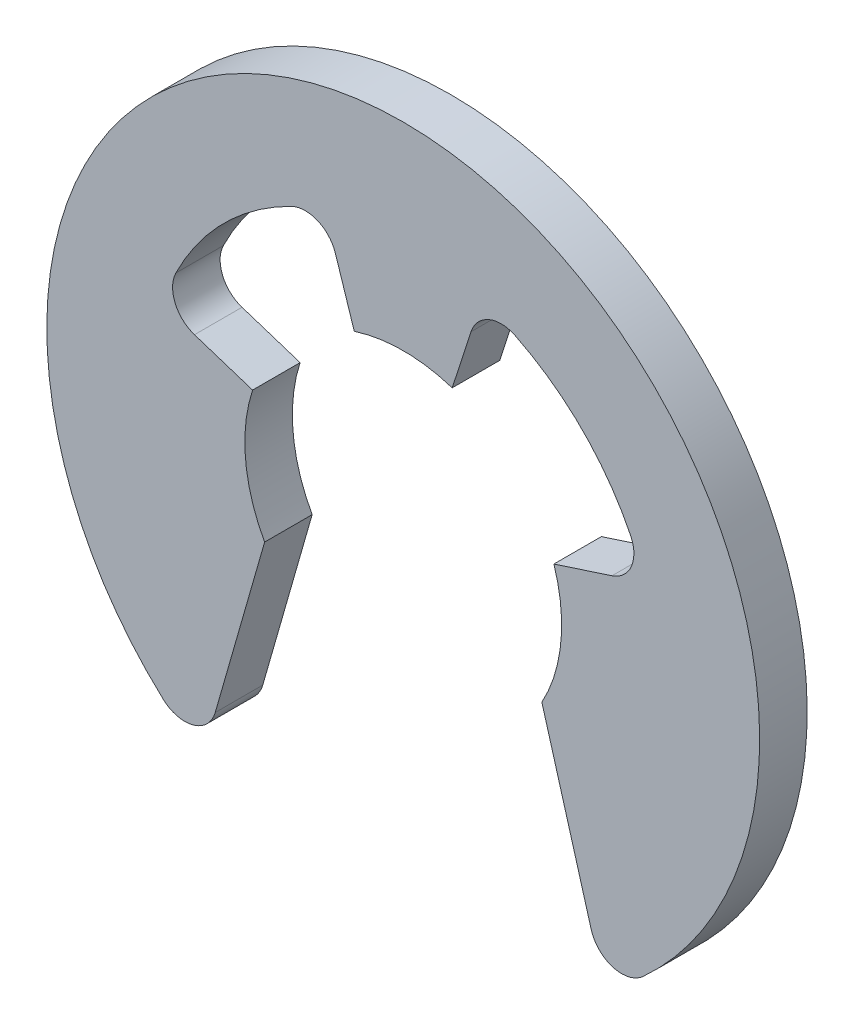
ISO-10303-21;
HEADER;
FILE_DESCRIPTION(('STEP AP214'),'2;1');
FILE_NAME('part.step','',(''),(''),'','','');
FILE_SCHEMA(('AUTOMOTIVE_DESIGN { 1 0 10303 214 1 1 1 1 }'));
ENDSEC;
DATA;
#1=APPLICATION_CONTEXT('core data for automotive mechanical design processes');
#2=APPLICATION_PROTOCOL_DEFINITION('international standard','automotive_design',2000,#1);
#3=PRODUCT_CONTEXT('',#1,'mechanical');
#4=PRODUCT('Part','Part','',(#3));
#5=PRODUCT_RELATED_PRODUCT_CATEGORY('part','',(#4));
#6=PRODUCT_DEFINITION_FORMATION('','',#4);
#7=PRODUCT_DEFINITION_CONTEXT('part definition',#1,'design');
#8=PRODUCT_DEFINITION('design','',#6,#7);
#9=PRODUCT_DEFINITION_SHAPE('','',#8);
#10=(LENGTH_UNIT() NAMED_UNIT(*) SI_UNIT(.MILLI.,.METRE.));
#11=(NAMED_UNIT(*) PLANE_ANGLE_UNIT() SI_UNIT($,.RADIAN.));
#12=(NAMED_UNIT(*) SI_UNIT($,.STERADIAN.) SOLID_ANGLE_UNIT());
#13=UNCERTAINTY_MEASURE_WITH_UNIT(LENGTH_MEASURE(1.E-05),#10,'distance_accuracy_value','');
#14=(GEOMETRIC_REPRESENTATION_CONTEXT(3) GLOBAL_UNCERTAINTY_ASSIGNED_CONTEXT((#13)) GLOBAL_UNIT_ASSIGNED_CONTEXT((#10,
#11,#12)) REPRESENTATION_CONTEXT('',''));
#15=CARTESIAN_POINT('',(0.,0.,0.));
#16=DIRECTION('',(0.,0.,1.));
#17=DIRECTION('',(1.,0.,0.));
#18=AXIS2_PLACEMENT_3D('',#15,#16,#17);
#19=CARTESIAN_POINT('',(2.51203833359828,1.23679562197348,0.));
#20=DIRECTION('',(0.,0.,-1.));
#21=DIRECTION('',(-1.,0.,0.));
#22=AXIS2_PLACEMENT_3D('',#19,#20,#21);
#23=PLANE('',#22);
#24=DIRECTION('',(0.30901699437494,0.951056516295156,0.));
#25=VECTOR('',#24,1.);
#26=CARTESIAN_POINT('',(0.856373015455397,2.63564513134827,0.));
#27=LINE('',#26,#25);
#28=CARTESIAN_POINT('',(0.856373015455397,2.63564513134827,0.));
#29=VERTEX_POINT('',#28);
#30=CARTESIAN_POINT('',(0.618033988749878,1.9021130325903,0.));
#31=VERTEX_POINT('',#30);
#32=EDGE_CURVE('E171',#29,#31,#27,.F.);
#33=ORIENTED_EDGE('',*,*,#32,.F.);
#34=CARTESIAN_POINT('',(1.23679562197346,2.51203833359829,0.));
#35=DIRECTION('',(0.,0.,1.));
#36=DIRECTION('',(1.,0.,0.));
#37=AXIS2_PLACEMENT_3D('',#34,#35,#36);
#38=CIRCLE('',#37,0.4);
#39=CARTESIAN_POINT('',(1.41348071082681,2.87090095268376,0.));
#40=VERTEX_POINT('',#39);
#41=EDGE_CURVE('E229',#29,#40,#38,.F.);
#42=ORIENTED_EDGE('',*,*,#41,.T.);
#43=CARTESIAN_POINT('',(0.,0.,0.));
#44=DIRECTION('',(0.,0.,1.));
#45=DIRECTION('',(1.,0.,0.));
#46=AXIS2_PLACEMENT_3D('',#43,#44,#45);
#47=CIRCLE('',#46,3.2);
#48=CARTESIAN_POINT('',(2.87090095268375,1.41348071082683,0.));
#49=VERTEX_POINT('',#48);
#50=EDGE_CURVE('E233',#40,#49,#47,.F.);
#51=ORIENTED_EDGE('',*,*,#50,.T.);
#52=CARTESIAN_POINT('',(2.51203833359828,1.23679562197348,0.));
#53=DIRECTION('',(0.,0.,1.));
#54=DIRECTION('',(1.,0.,0.));
#55=AXIS2_PLACEMENT_3D('',#52,#53,#54);
#56=CIRCLE('',#55,0.4);
#57=CARTESIAN_POINT('',(2.63564513134826,0.856373015455419,0.));
#58=VERTEX_POINT('',#57);
#59=EDGE_CURVE('E235',#49,#58,#56,.F.);
#60=ORIENTED_EDGE('',*,*,#59,.T.);
#61=DIRECTION('',(-0.951056516295153,-0.309016994374949,0.));
#62=VECTOR('',#61,1.);
#63=CARTESIAN_POINT('',(1.90211303259031,0.618033988749897,0.));
#64=LINE('',#63,#62);
#65=CARTESIAN_POINT('',(1.90211303259029,0.618033988749893,0.));
#66=VERTEX_POINT('',#65);
#67=EDGE_CURVE('E176',#66,#58,#64,.F.);
#68=ORIENTED_EDGE('',*,*,#67,.F.);
#69=CARTESIAN_POINT('',(0.,0.,0.));
#70=DIRECTION('',(0.,0.,1.));
#71=DIRECTION('',(1.,0.,0.));
#72=AXIS2_PLACEMENT_3D('',#69,#70,#71);
#73=CIRCLE('',#72,1.99999999999999);
#74=CARTESIAN_POINT('',(1.75,-0.968245836551837,0.));
#75=VERTEX_POINT('',#74);
#76=EDGE_CURVE('E237',#66,#75,#73,.F.);
#77=ORIENTED_EDGE('',*,*,#76,.T.);
#78=DIRECTION('',(0.275637355817,-0.961261695938319,0.));
#79=VECTOR('',#78,1.);
#80=CARTESIAN_POINT('',(1.75,-0.968245836551855,0.));
#81=LINE('',#80,#79);
#82=CARTESIAN_POINT('',(2.37379988454332,-3.14369456397451,0.));
#83=VERTEX_POINT('',#82);
#84=EDGE_CURVE('E181',#83,#75,#81,.F.);
#85=ORIENTED_EDGE('',*,*,#84,.F.);
#86=CARTESIAN_POINT('',(2.75830456291865,-3.03343962164771,0.));
#87=DIRECTION('',(0.,0.,1.));
#88=DIRECTION('',(1.,0.,0.));
#89=AXIS2_PLACEMENT_3D('',#86,#87,#88);
#90=CIRCLE('',#89,0.4);
#91=CARTESIAN_POINT('',(3.02740744710583,-3.32938495058895,0.));
#92=VERTEX_POINT('',#91);
#93=EDGE_CURVE('E239',#92,#83,#90,.F.);
#94=ORIENTED_EDGE('',*,*,#93,.F.);
#95=CARTESIAN_POINT('',(0.,0.,0.));
#96=DIRECTION('',(0.,0.,1.));
#97=DIRECTION('',(1.,0.,0.));
#98=AXIS2_PLACEMENT_3D('',#95,#96,#97);
#99=CIRCLE('',#98,4.5);
#100=CARTESIAN_POINT('',(-3.02740744710583,-3.32938495058895,0.));
#101=VERTEX_POINT('',#100);
#102=EDGE_CURVE('E242',#101,#92,#99,.F.);
#103=ORIENTED_EDGE('',*,*,#102,.F.);
#104=CARTESIAN_POINT('',(-2.75830456291864,-3.03343962164771,0.));
#105=DIRECTION('',(0.,0.,1.));
#106=DIRECTION('',(1.,0.,0.));
#107=AXIS2_PLACEMENT_3D('',#104,#105,#106);
#108=CIRCLE('',#107,0.4);
#109=CARTESIAN_POINT('',(-2.37379988454332,-3.14369456397451,0.));
#110=VERTEX_POINT('',#109);
#111=EDGE_CURVE('E245',#110,#101,#108,.F.);
#112=ORIENTED_EDGE('',*,*,#111,.F.);
#113=DIRECTION('',(0.275637355817,0.961261695938319,0.));
#114=VECTOR('',#113,1.);
#115=CARTESIAN_POINT('',(-1.75,-0.968245836551855,0.));
#116=LINE('',#115,#114);
#117=CARTESIAN_POINT('',(-1.74999999999999,-0.968245836551838,0.));
#118=VERTEX_POINT('',#117);
#119=EDGE_CURVE('E186',#118,#110,#116,.F.);
#120=ORIENTED_EDGE('',*,*,#119,.F.);
#121=CARTESIAN_POINT('',(0.,0.,0.));
#122=DIRECTION('',(0.,0.,1.));
#123=DIRECTION('',(1.,0.,0.));
#124=AXIS2_PLACEMENT_3D('',#121,#122,#123);
#125=CIRCLE('',#124,1.99999999999999);
#126=CARTESIAN_POINT('',(-1.9021130325903,0.618033988749893,0.));
#127=VERTEX_POINT('',#126);
#128=EDGE_CURVE('E153',#118,#127,#125,.F.);
#129=ORIENTED_EDGE('',*,*,#128,.T.);
#130=DIRECTION('',(-0.951056516295153,0.309016994374948,0.));
#131=VECTOR('',#130,1.);
#132=CARTESIAN_POINT('',(-1.90211303259031,0.618033988749897,0.));
#133=LINE('',#132,#131);
#134=CARTESIAN_POINT('',(-2.63564513134826,0.856373015455418,0.));
#135=VERTEX_POINT('',#134);
#136=EDGE_CURVE('E150',#135,#127,#133,.F.);
#137=ORIENTED_EDGE('',*,*,#136,.F.);
#138=CARTESIAN_POINT('',(-2.51203833359828,1.23679562197348,0.));
#139=DIRECTION('',(0.,0.,1.));
#140=DIRECTION('',(1.,0.,0.));
#141=AXIS2_PLACEMENT_3D('',#138,#139,#140);
#142=CIRCLE('',#141,0.4);
#143=CARTESIAN_POINT('',(-2.87090095268375,1.41348071082683,0.));
#144=VERTEX_POINT('',#143);
#145=EDGE_CURVE('E20',#135,#144,#142,.F.);
#146=ORIENTED_EDGE('',*,*,#145,.T.);
#147=CARTESIAN_POINT('',(0.,0.,0.));
#148=DIRECTION('',(0.,0.,1.));
#149=DIRECTION('',(1.,0.,0.));
#150=AXIS2_PLACEMENT_3D('',#147,#148,#149);
#151=CIRCLE('',#150,3.2);
#152=CARTESIAN_POINT('',(-1.41348071082681,2.87090095268376,0.));
#153=VERTEX_POINT('',#152);
#154=EDGE_CURVE('E223',#144,#153,#151,.F.);
#155=ORIENTED_EDGE('',*,*,#154,.T.);
#156=CARTESIAN_POINT('',(-1.23679562197346,2.51203833359829,0.));
#157=DIRECTION('',(0.,0.,1.));
#158=DIRECTION('',(1.,0.,0.));
#159=AXIS2_PLACEMENT_3D('',#156,#157,#158);
#160=CIRCLE('',#159,0.4);
#161=CARTESIAN_POINT('',(-0.856373015455398,2.63564513134827,0.));
#162=VERTEX_POINT('',#161);
#163=EDGE_CURVE('E169',#153,#162,#160,.F.);
#164=ORIENTED_EDGE('',*,*,#163,.T.);
#165=DIRECTION('',(0.309016994374941,-0.951056516295156,0.));
#166=VECTOR('',#165,1.);
#167=CARTESIAN_POINT('',(-0.856373015455398,2.63564513134827,0.));
#168=LINE('',#167,#166);
#169=CARTESIAN_POINT('',(-0.618033988749878,1.9021130325903,0.));
#170=VERTEX_POINT('',#169);
#171=EDGE_CURVE('E166',#170,#162,#168,.F.);
#172=ORIENTED_EDGE('',*,*,#171,.F.);
#173=CARTESIAN_POINT('',(0.,0.,0.));
#174=DIRECTION('',(0.,0.,1.));
#175=DIRECTION('',(1.,0.,0.));
#176=AXIS2_PLACEMENT_3D('',#173,#174,#175);
#177=CIRCLE('',#176,1.99999999999999);
#178=EDGE_CURVE('E174',#170,#31,#177,.F.);
#179=ORIENTED_EDGE('',*,*,#178,.T.);
#180=EDGE_LOOP('',(#33,#42,#51,#60,#68,#77,#85,#94,#103,#112,#120,#129,#137,#146,#155,#164,#172,#179));
#181=FACE_BOUND('',#180,.T.);
#182=ADVANCED_FACE('F17',(#181),#23,.F.);
#183=CARTESIAN_POINT('',(-2.51203833359828,1.23679562197348,-0.8));
#184=DIRECTION('',(0.,0.,1.));
#185=DIRECTION('',(1.,0.,0.));
#186=AXIS2_PLACEMENT_3D('',#183,#184,#185);
#187=CYLINDRICAL_SURFACE('',#186,0.4);
#188=DIRECTION('',(0.,0.,1.));
#189=VECTOR('',#188,1.);
#190=CARTESIAN_POINT('',(-2.87090095268375,1.41348071082683,-0.8));
#191=LINE('',#190,#189);
#192=CARTESIAN_POINT('',(-2.87090095268375,1.41348071082683,-0.6));
#193=VERTEX_POINT('',#192);
#194=EDGE_CURVE('E146',#193,#144,#191,.T.);
#195=ORIENTED_EDGE('',*,*,#194,.T.);
#196=ORIENTED_EDGE('',*,*,#145,.F.);
#197=DIRECTION('',(0.,0.,1.));
#198=VECTOR('',#197,1.);
#199=CARTESIAN_POINT('',(-2.63564513134826,0.856373015455419,-0.8));
#200=LINE('',#199,#198);
#201=CARTESIAN_POINT('',(-2.63564513134826,0.856373015455419,-0.6));
#202=VERTEX_POINT('',#201);
#203=EDGE_CURVE('E143',#202,#135,#200,.T.);
#204=ORIENTED_EDGE('',*,*,#203,.F.);
#205=CARTESIAN_POINT('',(-2.51203833359828,1.23679562197348,-0.6));
#206=DIRECTION('',(0.,0.,1.));
#207=DIRECTION('',(1.,0.,0.));
#208=AXIS2_PLACEMENT_3D('',#205,#206,#207);
#209=CIRCLE('',#208,0.4);
#210=EDGE_CURVE('E221',#193,#202,#209,.T.);
#211=ORIENTED_EDGE('',*,*,#210,.F.);
#212=EDGE_LOOP('',(#195,#196,#204,#211));
#213=FACE_BOUND('',#212,.T.);
#214=ADVANCED_FACE('F141',(#213),#187,.F.);
#215=CARTESIAN_POINT('',(-1.90211303259031,0.618033988749897,-0.8));
#216=DIRECTION('',(0.309016994374949,0.951056516295153,0.));
#217=DIRECTION('',(-0.951056516295153,0.309016994374948,0.));
#218=AXIS2_PLACEMENT_3D('',#215,#216,#217);
#219=PLANE('',#218);
#220=ORIENTED_EDGE('',*,*,#203,.T.);
#221=ORIENTED_EDGE('',*,*,#136,.T.);
#222=DIRECTION('',(0.,0.,1.));
#223=VECTOR('',#222,1.);
#224=CARTESIAN_POINT('',(-1.9021130325903,0.618033988749893,0.));
#225=LINE('',#224,#223);
#226=CARTESIAN_POINT('',(-1.9021130325903,0.618033988749893,-0.6));
#227=VERTEX_POINT('',#226);
#228=EDGE_CURVE('E164',#127,#227,#225,.F.);
#229=ORIENTED_EDGE('',*,*,#228,.T.);
#230=DIRECTION('',(0.951056516295153,-0.309016994374948,0.));
#231=VECTOR('',#230,1.);
#232=CARTESIAN_POINT('',(-2.63564513134826,0.856373015455419,-0.6));
#233=LINE('',#232,#231);
#234=EDGE_CURVE('E159',#202,#227,#233,.T.);
#235=ORIENTED_EDGE('',*,*,#234,.F.);
#236=EDGE_LOOP('',(#220,#221,#229,#235));
#237=FACE_BOUND('',#236,.T.);
#238=ADVANCED_FACE('F157',(#237),#219,.T.);
#239=CARTESIAN_POINT('',(0.,0.,0.));
#240=DIRECTION('',(0.,0.,1.));
#241=DIRECTION('',(1.,0.,0.));
#242=AXIS2_PLACEMENT_3D('',#239,#240,#241);
#243=CYLINDRICAL_SURFACE('',#242,1.99999999999999);
#244=ORIENTED_EDGE('',*,*,#228,.F.);
#245=ORIENTED_EDGE('',*,*,#128,.F.);
#246=DIRECTION('',(0.,0.,1.));
#247=VECTOR('',#246,1.);
#248=CARTESIAN_POINT('',(-1.74999999999999,-0.968245836551838,-0.8));
#249=LINE('',#248,#247);
#250=CARTESIAN_POINT('',(-1.74999999999999,-0.968245836551838,-0.6));
#251=VERTEX_POINT('',#250);
#252=EDGE_CURVE('E188',#251,#118,#249,.T.);
#253=ORIENTED_EDGE('',*,*,#252,.F.);
#254=CARTESIAN_POINT('',(0.,0.,-0.6));
#255=DIRECTION('',(0.,0.,1.));
#256=DIRECTION('',(1.,0.,0.));
#257=AXIS2_PLACEMENT_3D('',#254,#255,#256);
#258=CIRCLE('',#257,1.99999999999999);
#259=EDGE_CURVE('E218',#227,#251,#258,.T.);
#260=ORIENTED_EDGE('',*,*,#259,.F.);
#261=EDGE_LOOP('',(#244,#245,#253,#260));
#262=FACE_BOUND('',#261,.T.);
#263=ADVANCED_FACE('F448',(#262),#243,.F.);
#264=CARTESIAN_POINT('',(-1.75,-0.968245836551855,-0.8));
#265=DIRECTION('',(0.961261695938319,-0.275637355817,0.));
#266=DIRECTION('',(0.275637355817,0.961261695938319,0.));
#267=AXIS2_PLACEMENT_3D('',#264,#265,#266);
#268=PLANE('',#267);
#269=ORIENTED_EDGE('',*,*,#252,.T.);
#270=ORIENTED_EDGE('',*,*,#119,.T.);
#271=DIRECTION('',(0.,0.,1.));
#272=VECTOR('',#271,1.);
#273=CARTESIAN_POINT('',(-2.37379988454332,-3.14369456397451,-0.8));
#274=LINE('',#273,#272);
#275=CARTESIAN_POINT('',(-2.37379988454332,-3.14369456397451,-0.6));
#276=VERTEX_POINT('',#275);
#277=EDGE_CURVE('E187',#276,#110,#274,.T.);
#278=ORIENTED_EDGE('',*,*,#277,.F.);
#279=DIRECTION('',(-0.275637355817,-0.961261695938319,0.));
#280=VECTOR('',#279,1.);
#281=CARTESIAN_POINT('',(-1.74999999999999,-0.968245836551838,-0.6));
#282=LINE('',#281,#280);
#283=EDGE_CURVE('E217',#251,#276,#282,.T.);
#284=ORIENTED_EDGE('',*,*,#283,.F.);
#285=EDGE_LOOP('',(#269,#270,#278,#284));
#286=FACE_BOUND('',#285,.T.);
#287=ADVANCED_FACE('F438',(#286),#268,.T.);
#288=CARTESIAN_POINT('',(-2.75830456291864,-3.03343962164771,-0.8));
#289=DIRECTION('',(0.,0.,1.));
#290=DIRECTION('',(1.,0.,0.));
#291=AXIS2_PLACEMENT_3D('',#288,#289,#290);
#292=CYLINDRICAL_SURFACE('',#291,0.4);
#293=ORIENTED_EDGE('',*,*,#277,.T.);
#294=ORIENTED_EDGE('',*,*,#111,.T.);
#295=DIRECTION('',(0.,0.,1.));
#296=VECTOR('',#295,1.);
#297=CARTESIAN_POINT('',(-3.02740744710583,-3.32938495058895,-0.8));
#298=LINE('',#297,#296);
#299=CARTESIAN_POINT('',(-3.02740744710583,-3.32938495058895,-0.6));
#300=VERTEX_POINT('',#299);
#301=EDGE_CURVE('E244',#300,#101,#298,.T.);
#302=ORIENTED_EDGE('',*,*,#301,.F.);
#303=CARTESIAN_POINT('',(-2.75830456291864,-3.03343962164771,-0.6));
#304=DIRECTION('',(0.,0.,1.));
#305=DIRECTION('',(1.,0.,0.));
#306=AXIS2_PLACEMENT_3D('',#303,#304,#305);
#307=CIRCLE('',#306,0.4);
#308=EDGE_CURVE('E214',#276,#300,#307,.F.);
#309=ORIENTED_EDGE('',*,*,#308,.F.);
#310=EDGE_LOOP('',(#293,#294,#302,#309));
#311=FACE_BOUND('',#310,.T.);
#312=ADVANCED_FACE('F428',(#311),#292,.T.);
#313=CARTESIAN_POINT('',(0.,0.,-0.8));
#314=DIRECTION('',(0.,0.,1.));
#315=DIRECTION('',(1.,0.,0.));
#316=AXIS2_PLACEMENT_3D('',#313,#314,#315);
#317=CYLINDRICAL_SURFACE('',#316,4.5);
#318=ORIENTED_EDGE('',*,*,#102,.T.);
#319=DIRECTION('',(0.,0.,1.));
#320=VECTOR('',#319,1.);
#321=CARTESIAN_POINT('',(3.02740744710583,-3.32938495058895,-0.8));
#322=LINE('',#321,#320);
#323=CARTESIAN_POINT('',(3.02740744710583,-3.32938495058895,-0.6));
#324=VERTEX_POINT('',#323);
#325=EDGE_CURVE('E241',#324,#92,#322,.T.);
#326=ORIENTED_EDGE('',*,*,#325,.F.);
#327=CARTESIAN_POINT('',(0.,0.,-0.6));
#328=DIRECTION('',(0.,0.,1.));
#329=DIRECTION('',(1.,0.,0.));
#330=AXIS2_PLACEMENT_3D('',#327,#328,#329);
#331=CIRCLE('',#330,4.5);
#332=EDGE_CURVE('E212',#300,#324,#331,.F.);
#333=ORIENTED_EDGE('',*,*,#332,.F.);
#334=ORIENTED_EDGE('',*,*,#301,.T.);
#335=EDGE_LOOP('',(#318,#326,#333,#334));
#336=FACE_BOUND('',#335,.T.);
#337=ADVANCED_FACE('F418',(#336),#317,.T.);
#338=CARTESIAN_POINT('',(2.75830456291865,-3.03343962164771,-0.8));
#339=DIRECTION('',(0.,0.,1.));
#340=DIRECTION('',(1.,0.,0.));
#341=AXIS2_PLACEMENT_3D('',#338,#339,#340);
#342=CYLINDRICAL_SURFACE('',#341,0.4);
#343=ORIENTED_EDGE('',*,*,#325,.T.);
#344=ORIENTED_EDGE('',*,*,#93,.T.);
#345=DIRECTION('',(0.,0.,1.));
#346=VECTOR('',#345,1.);
#347=CARTESIAN_POINT('',(2.37379988454332,-3.14369456397451,-0.8));
#348=LINE('',#347,#346);
#349=CARTESIAN_POINT('',(2.37379988454332,-3.14369456397451,-0.6));
#350=VERTEX_POINT('',#349);
#351=EDGE_CURVE('E185',#350,#83,#348,.T.);
#352=ORIENTED_EDGE('',*,*,#351,.F.);
#353=CARTESIAN_POINT('',(2.75830456291865,-3.03343962164771,-0.6));
#354=DIRECTION('',(0.,0.,1.));
#355=DIRECTION('',(1.,0.,0.));
#356=AXIS2_PLACEMENT_3D('',#353,#354,#355);
#357=CIRCLE('',#356,0.4);
#358=EDGE_CURVE('E209',#324,#350,#357,.F.);
#359=ORIENTED_EDGE('',*,*,#358,.F.);
#360=EDGE_LOOP('',(#343,#344,#352,#359));
#361=FACE_BOUND('',#360,.T.);
#362=ADVANCED_FACE('F408',(#361),#342,.T.);
#363=CARTESIAN_POINT('',(1.75,-0.968245836551855,-0.8));
#364=DIRECTION('',(-0.961261695938319,-0.275637355817,0.));
#365=DIRECTION('',(0.275637355817,-0.961261695938319,0.));
#366=AXIS2_PLACEMENT_3D('',#363,#364,#365);
#367=PLANE('',#366);
#368=ORIENTED_EDGE('',*,*,#351,.T.);
#369=ORIENTED_EDGE('',*,*,#84,.T.);
#370=DIRECTION('',(0.,0.,1.));
#371=VECTOR('',#370,1.);
#372=CARTESIAN_POINT('',(1.75,-0.968245836551837,0.));
#373=LINE('',#372,#371);
#374=CARTESIAN_POINT('',(1.75,-0.968245836551837,-0.6));
#375=VERTEX_POINT('',#374);
#376=EDGE_CURVE('E184',#75,#375,#373,.F.);
#377=ORIENTED_EDGE('',*,*,#376,.T.);
#378=DIRECTION('',(-0.275637355817,0.961261695938319,0.));
#379=VECTOR('',#378,1.);
#380=CARTESIAN_POINT('',(2.37379988454332,-3.14369456397451,-0.6));
#381=LINE('',#380,#379);
#382=EDGE_CURVE('E208',#350,#375,#381,.T.);
#383=ORIENTED_EDGE('',*,*,#382,.F.);
#384=EDGE_LOOP('',(#368,#369,#377,#383));
#385=FACE_BOUND('',#384,.T.);
#386=ADVANCED_FACE('F398',(#385),#367,.T.);
#387=CARTESIAN_POINT('',(0.,0.,0.));
#388=DIRECTION('',(0.,0.,1.));
#389=DIRECTION('',(1.,0.,0.));
#390=AXIS2_PLACEMENT_3D('',#387,#388,#389);
#391=CYLINDRICAL_SURFACE('',#390,1.99999999999999);
#392=DIRECTION('',(0.,0.,1.));
#393=VECTOR('',#392,1.);
#394=CARTESIAN_POINT('',(1.90211303259029,0.618033988749893,-0.8));
#395=LINE('',#394,#393);
#396=CARTESIAN_POINT('',(1.9021130325903,0.618033988749893,-0.6));
#397=VERTEX_POINT('',#396);
#398=EDGE_CURVE('E180',#397,#66,#395,.T.);
#399=ORIENTED_EDGE('',*,*,#398,.F.);
#400=CARTESIAN_POINT('',(0.,0.,-0.6));
#401=DIRECTION('',(0.,0.,1.));
#402=DIRECTION('',(1.,0.,0.));
#403=AXIS2_PLACEMENT_3D('',#400,#401,#402);
#404=CIRCLE('',#403,1.99999999999999);
#405=EDGE_CURVE('E206',#375,#397,#404,.T.);
#406=ORIENTED_EDGE('',*,*,#405,.F.);
#407=ORIENTED_EDGE('',*,*,#376,.F.);
#408=ORIENTED_EDGE('',*,*,#76,.F.);
#409=EDGE_LOOP('',(#399,#406,#407,#408));
#410=FACE_BOUND('',#409,.T.);
#411=ADVANCED_FACE('F388',(#410),#391,.F.);
#412=CARTESIAN_POINT('',(1.90211303259031,0.618033988749897,-0.8));
#413=DIRECTION('',(-0.309016994374949,0.951056516295153,0.));
#414=DIRECTION('',(-0.951056516295153,-0.309016994374949,0.));
#415=AXIS2_PLACEMENT_3D('',#412,#413,#414);
#416=PLANE('',#415);
#417=ORIENTED_EDGE('',*,*,#398,.T.);
#418=ORIENTED_EDGE('',*,*,#67,.T.);
#419=DIRECTION('',(0.,0.,1.));
#420=VECTOR('',#419,1.);
#421=CARTESIAN_POINT('',(2.63564513134826,0.856373015455419,-0.8));
#422=LINE('',#421,#420);
#423=CARTESIAN_POINT('',(2.63564513134826,0.856373015455419,-0.6));
#424=VERTEX_POINT('',#423);
#425=EDGE_CURVE('E179',#58,#424,#422,.F.);
#426=ORIENTED_EDGE('',*,*,#425,.T.);
#427=DIRECTION('',(0.951056516295153,0.309016994374949,0.));
#428=VECTOR('',#427,1.);
#429=CARTESIAN_POINT('',(1.90211303259029,0.618033988749893,-0.6));
#430=LINE('',#429,#428);
#431=EDGE_CURVE('E205',#397,#424,#430,.T.);
#432=ORIENTED_EDGE('',*,*,#431,.F.);
#433=EDGE_LOOP('',(#417,#418,#426,#432));
#434=FACE_BOUND('',#433,.T.);
#435=ADVANCED_FACE('F378',(#434),#416,.T.);
#436=CARTESIAN_POINT('',(2.51203833359828,1.23679562197348,-0.8));
#437=DIRECTION('',(0.,0.,1.));
#438=DIRECTION('',(1.,0.,0.));
#439=AXIS2_PLACEMENT_3D('',#436,#437,#438);
#440=CYLINDRICAL_SURFACE('',#439,0.4);
#441=DIRECTION('',(0.,0.,1.));
#442=VECTOR('',#441,1.);
#443=CARTESIAN_POINT('',(2.87090095268375,1.41348071082683,-0.8));
#444=LINE('',#443,#442);
#445=CARTESIAN_POINT('',(2.87090095268375,1.41348071082683,-0.6));
#446=VERTEX_POINT('',#445);
#447=EDGE_CURVE('E232',#49,#446,#444,.F.);
#448=ORIENTED_EDGE('',*,*,#447,.T.);
#449=CARTESIAN_POINT('',(2.51203833359828,1.23679562197348,-0.6));
#450=DIRECTION('',(0.,0.,1.));
#451=DIRECTION('',(1.,0.,0.));
#452=AXIS2_PLACEMENT_3D('',#449,#450,#451);
#453=CIRCLE('',#452,0.4);
#454=EDGE_CURVE('E203',#424,#446,#453,.T.);
#455=ORIENTED_EDGE('',*,*,#454,.F.);
#456=ORIENTED_EDGE('',*,*,#425,.F.);
#457=ORIENTED_EDGE('',*,*,#59,.F.);
#458=EDGE_LOOP('',(#448,#455,#456,#457));
#459=FACE_BOUND('',#458,.T.);
#460=ADVANCED_FACE('F368',(#459),#440,.F.);
#461=CARTESIAN_POINT('',(0.,0.,-0.8));
#462=DIRECTION('',(0.,0.,1.));
#463=DIRECTION('',(1.,0.,0.));
#464=AXIS2_PLACEMENT_3D('',#461,#462,#463);
#465=CYLINDRICAL_SURFACE('',#464,3.2);
#466=ORIENTED_EDGE('',*,*,#447,.F.);
#467=ORIENTED_EDGE('',*,*,#50,.F.);
#468=DIRECTION('',(0.,0.,1.));
#469=VECTOR('',#468,1.);
#470=CARTESIAN_POINT('',(1.41348071082681,2.87090095268376,-0.8));
#471=LINE('',#470,#469);
#472=CARTESIAN_POINT('',(1.41348071082681,2.87090095268376,-0.6));
#473=VERTEX_POINT('',#472);
#474=EDGE_CURVE('E231',#40,#473,#471,.F.);
#475=ORIENTED_EDGE('',*,*,#474,.T.);
#476=CARTESIAN_POINT('',(0.,0.,-0.6));
#477=DIRECTION('',(0.,0.,1.));
#478=DIRECTION('',(1.,0.,0.));
#479=AXIS2_PLACEMENT_3D('',#476,#477,#478);
#480=CIRCLE('',#479,3.2);
#481=EDGE_CURVE('E200',#446,#473,#480,.T.);
#482=ORIENTED_EDGE('',*,*,#481,.F.);
#483=EDGE_LOOP('',(#466,#467,#475,#482));
#484=FACE_BOUND('',#483,.T.);
#485=ADVANCED_FACE('F358',(#484),#465,.F.);
#486=CARTESIAN_POINT('',(1.23679562197346,2.51203833359829,-0.8));
#487=DIRECTION('',(0.,0.,1.));
#488=DIRECTION('',(1.,0.,0.));
#489=AXIS2_PLACEMENT_3D('',#486,#487,#488);
#490=CYLINDRICAL_SURFACE('',#489,0.4);
#491=ORIENTED_EDGE('',*,*,#474,.F.);
#492=ORIENTED_EDGE('',*,*,#41,.F.);
#493=DIRECTION('',(0.,0.,1.));
#494=VECTOR('',#493,1.);
#495=CARTESIAN_POINT('',(0.856373015455397,2.63564513134827,-0.8));
#496=LINE('',#495,#494);
#497=CARTESIAN_POINT('',(0.856373015455397,2.63564513134827,-0.6));
#498=VERTEX_POINT('',#497);
#499=EDGE_CURVE('E175',#498,#29,#496,.T.);
#500=ORIENTED_EDGE('',*,*,#499,.F.);
#501=CARTESIAN_POINT('',(1.23679562197346,2.51203833359829,-0.6));
#502=DIRECTION('',(0.,0.,1.));
#503=DIRECTION('',(1.,0.,0.));
#504=AXIS2_PLACEMENT_3D('',#501,#502,#503);
#505=CIRCLE('',#504,0.4);
#506=EDGE_CURVE('E197',#473,#498,#505,.T.);
#507=ORIENTED_EDGE('',*,*,#506,.F.);
#508=EDGE_LOOP('',(#491,#492,#500,#507));
#509=FACE_BOUND('',#508,.T.);
#510=ADVANCED_FACE('F348',(#509),#490,.F.);
#511=CARTESIAN_POINT('',(0.856373015455397,2.63564513134827,-0.8));
#512=DIRECTION('',(0.951056516295156,-0.30901699437494,0.));
#513=DIRECTION('',(0.30901699437494,0.951056516295156,0.));
#514=AXIS2_PLACEMENT_3D('',#511,#512,#513);
#515=PLANE('',#514);
#516=ORIENTED_EDGE('',*,*,#499,.T.);
#517=ORIENTED_EDGE('',*,*,#32,.T.);
#518=DIRECTION('',(0.,0.,1.));
#519=VECTOR('',#518,1.);
#520=CARTESIAN_POINT('',(0.618033988749878,1.9021130325903,0.));
#521=LINE('',#520,#519);
#522=CARTESIAN_POINT('',(0.618033988749878,1.9021130325903,-0.6));
#523=VERTEX_POINT('',#522);
#524=EDGE_CURVE('E228',#31,#523,#521,.F.);
#525=ORIENTED_EDGE('',*,*,#524,.T.);
#526=DIRECTION('',(-0.309016994374941,-0.951056516295156,0.));
#527=VECTOR('',#526,1.);
#528=CARTESIAN_POINT('',(0.856373015455397,2.63564513134827,-0.6));
#529=LINE('',#528,#527);
#530=EDGE_CURVE('E196',#498,#523,#529,.T.);
#531=ORIENTED_EDGE('',*,*,#530,.F.);
#532=EDGE_LOOP('',(#516,#517,#525,#531));
#533=FACE_BOUND('',#532,.T.);
#534=ADVANCED_FACE('F338',(#533),#515,.T.);
#535=CARTESIAN_POINT('',(0.,0.,0.));
#536=DIRECTION('',(0.,0.,1.));
#537=DIRECTION('',(1.,0.,0.));
#538=AXIS2_PLACEMENT_3D('',#535,#536,#537);
#539=CYLINDRICAL_SURFACE('',#538,1.99999999999999);
#540=ORIENTED_EDGE('',*,*,#524,.F.);
#541=ORIENTED_EDGE('',*,*,#178,.F.);
#542=DIRECTION('',(0.,0.,1.));
#543=VECTOR('',#542,1.);
#544=CARTESIAN_POINT('',(-0.618033988749878,1.9021130325903,-0.8));
#545=LINE('',#544,#543);
#546=CARTESIAN_POINT('',(-0.618033988749878,1.9021130325903,-0.6));
#547=VERTEX_POINT('',#546);
#548=EDGE_CURVE('E170',#547,#170,#545,.T.);
#549=ORIENTED_EDGE('',*,*,#548,.F.);
#550=CARTESIAN_POINT('',(0.,0.,-0.6));
#551=DIRECTION('',(0.,0.,1.));
#552=DIRECTION('',(1.,0.,0.));
#553=AXIS2_PLACEMENT_3D('',#550,#551,#552);
#554=CIRCLE('',#553,1.99999999999999);
#555=EDGE_CURVE('E193',#523,#547,#554,.T.);
#556=ORIENTED_EDGE('',*,*,#555,.F.);
#557=EDGE_LOOP('',(#540,#541,#549,#556));
#558=FACE_BOUND('',#557,.T.);
#559=ADVANCED_FACE('F304',(#558),#539,.F.);
#560=CARTESIAN_POINT('',(-0.856373015455398,2.63564513134827,-0.8));
#561=DIRECTION('',(-0.951056516295156,-0.309016994374941,0.));
#562=DIRECTION('',(0.309016994374941,-0.951056516295156,0.));
#563=AXIS2_PLACEMENT_3D('',#560,#561,#562);
#564=PLANE('',#563);
#565=ORIENTED_EDGE('',*,*,#548,.T.);
#566=ORIENTED_EDGE('',*,*,#171,.T.);
#567=DIRECTION('',(0.,0.,1.));
#568=VECTOR('',#567,1.);
#569=CARTESIAN_POINT('',(-0.856373015455398,2.63564513134827,-0.8));
#570=LINE('',#569,#568);
#571=CARTESIAN_POINT('',(-0.856373015455398,2.63564513134827,-0.6));
#572=VERTEX_POINT('',#571);
#573=EDGE_CURVE('E226',#162,#572,#570,.F.);
#574=ORIENTED_EDGE('',*,*,#573,.T.);
#575=DIRECTION('',(-0.309016994374941,0.951056516295156,0.));
#576=VECTOR('',#575,1.);
#577=CARTESIAN_POINT('',(-0.618033988749878,1.9021130325903,-0.6));
#578=LINE('',#577,#576);
#579=EDGE_CURVE('E192',#547,#572,#578,.T.);
#580=ORIENTED_EDGE('',*,*,#579,.F.);
#581=EDGE_LOOP('',(#565,#566,#574,#580));
#582=FACE_BOUND('',#581,.T.);
#583=ADVANCED_FACE('F290',(#582),#564,.T.);
#584=CARTESIAN_POINT('',(-1.23679562197346,2.51203833359829,-0.8));
#585=DIRECTION('',(0.,0.,1.));
#586=DIRECTION('',(1.,0.,0.));
#587=AXIS2_PLACEMENT_3D('',#584,#585,#586);
#588=CYLINDRICAL_SURFACE('',#587,0.4);
#589=ORIENTED_EDGE('',*,*,#573,.F.);
#590=ORIENTED_EDGE('',*,*,#163,.F.);
#591=DIRECTION('',(0.,0.,1.));
#592=VECTOR('',#591,1.);
#593=CARTESIAN_POINT('',(-1.41348071082681,2.87090095268376,-0.8));
#594=LINE('',#593,#592);
#595=CARTESIAN_POINT('',(-1.41348071082681,2.87090095268376,-0.6));
#596=VERTEX_POINT('',#595);
#597=EDGE_CURVE('E35',#153,#596,#594,.F.);
#598=ORIENTED_EDGE('',*,*,#597,.T.);
#599=CARTESIAN_POINT('',(-1.23679562197346,2.51203833359829,-0.6));
#600=DIRECTION('',(0.,0.,1.));
#601=DIRECTION('',(1.,0.,0.));
#602=AXIS2_PLACEMENT_3D('',#599,#600,#601);
#603=CIRCLE('',#602,0.4);
#604=EDGE_CURVE('E26',#572,#596,#603,.T.);
#605=ORIENTED_EDGE('',*,*,#604,.F.);
#606=EDGE_LOOP('',(#589,#590,#598,#605));
#607=FACE_BOUND('',#606,.T.);
#608=ADVANCED_FACE('F293',(#607),#588,.F.);
#609=CARTESIAN_POINT('',(0.,0.,-0.8));
#610=DIRECTION('',(0.,0.,1.));
#611=DIRECTION('',(1.,0.,0.));
#612=AXIS2_PLACEMENT_3D('',#609,#610,#611);
#613=CYLINDRICAL_SURFACE('',#612,3.2);
#614=ORIENTED_EDGE('',*,*,#597,.F.);
#615=ORIENTED_EDGE('',*,*,#154,.F.);
#616=ORIENTED_EDGE('',*,*,#194,.F.);
#617=CARTESIAN_POINT('',(0.,0.,-0.6));
#618=DIRECTION('',(0.,0.,1.));
#619=DIRECTION('',(1.,0.,0.));
#620=AXIS2_PLACEMENT_3D('',#617,#618,#619);
#621=CIRCLE('',#620,3.2);
#622=EDGE_CURVE('E11',#596,#193,#621,.T.);
#623=ORIENTED_EDGE('',*,*,#622,.F.);
#624=EDGE_LOOP('',(#614,#615,#616,#623));
#625=FACE_BOUND('',#624,.T.);
#626=ADVANCED_FACE('F295',(#625),#613,.F.);
#627=CARTESIAN_POINT('',(0.,0.,-0.6));
#628=DIRECTION('',(0.,0.,-1.));
#629=DIRECTION('',(-1.,0.,0.));
#630=AXIS2_PLACEMENT_3D('',#627,#628,#629);
#631=PLANE('',#630);
#632=ORIENTED_EDGE('',*,*,#604,.T.);
#633=ORIENTED_EDGE('',*,*,#622,.T.);
#634=ORIENTED_EDGE('',*,*,#210,.T.);
#635=ORIENTED_EDGE('',*,*,#234,.T.);
#636=ORIENTED_EDGE('',*,*,#259,.T.);
#637=ORIENTED_EDGE('',*,*,#283,.T.);
#638=ORIENTED_EDGE('',*,*,#308,.T.);
#639=ORIENTED_EDGE('',*,*,#332,.T.);
#640=ORIENTED_EDGE('',*,*,#358,.T.);
#641=ORIENTED_EDGE('',*,*,#382,.T.);
#642=ORIENTED_EDGE('',*,*,#405,.T.);
#643=ORIENTED_EDGE('',*,*,#431,.T.);
#644=ORIENTED_EDGE('',*,*,#454,.T.);
#645=ORIENTED_EDGE('',*,*,#481,.T.);
#646=ORIENTED_EDGE('',*,*,#506,.T.);
#647=ORIENTED_EDGE('',*,*,#530,.T.);
#648=ORIENTED_EDGE('',*,*,#555,.T.);
#649=ORIENTED_EDGE('',*,*,#579,.T.);
#650=EDGE_LOOP('',(#632,#633,#634,#635,#636,#637,#638,#639,#640,#641,#642,#643,#644,#645,#646,
#647,#648,#649));
#651=FACE_BOUND('',#650,.T.);
#652=ADVANCED_FACE('F287',(#651),#631,.T.);
#653=CLOSED_SHELL('',(#182,#214,#238,#263,#287,#312,#337,#362,#386,#411,#435,#460,#485,#510,
#534,#559,#583,#608,#626,#652));
#654=MANIFOLD_SOLID_BREP('B1',#653);
#655=ADVANCED_BREP_SHAPE_REPRESENTATION('',(#18,#654),#14);
#656=SHAPE_DEFINITION_REPRESENTATION(#9,#655);
ENDSEC;
END-ISO-10303-21;
